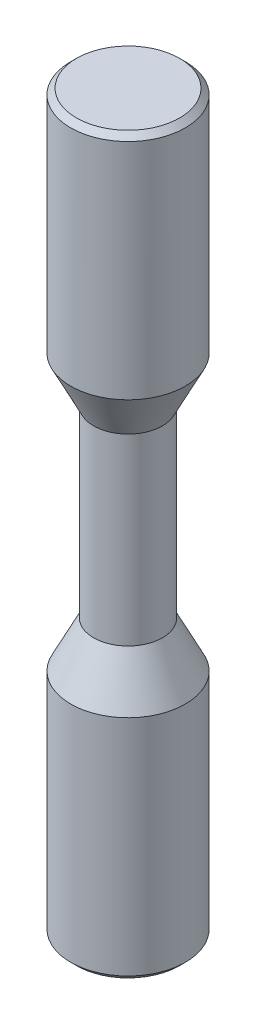
ISO-10303-21;
HEADER;
FILE_DESCRIPTION(('STEP AP214'),'2;1');
FILE_NAME('part.step','',(''),(''),'','','');
FILE_SCHEMA(('AUTOMOTIVE_DESIGN { 1 0 10303 214 1 1 1 1 }'));
ENDSEC;
DATA;
#1=APPLICATION_CONTEXT('core data for automotive mechanical design processes');
#2=APPLICATION_PROTOCOL_DEFINITION('international standard','automotive_design',2000,#1);
#3=PRODUCT_CONTEXT('',#1,'mechanical');
#4=PRODUCT('Part','Part','',(#3));
#5=PRODUCT_RELATED_PRODUCT_CATEGORY('part','',(#4));
#6=PRODUCT_DEFINITION_FORMATION('','',#4);
#7=PRODUCT_DEFINITION_CONTEXT('part definition',#1,'design');
#8=PRODUCT_DEFINITION('design','',#6,#7);
#9=PRODUCT_DEFINITION_SHAPE('','',#8);
#10=(LENGTH_UNIT() NAMED_UNIT(*) SI_UNIT(.MILLI.,.METRE.));
#11=(NAMED_UNIT(*) PLANE_ANGLE_UNIT() SI_UNIT($,.RADIAN.));
#12=(NAMED_UNIT(*) SI_UNIT($,.STERADIAN.) SOLID_ANGLE_UNIT());
#13=UNCERTAINTY_MEASURE_WITH_UNIT(LENGTH_MEASURE(1.E-05),#10,'distance_accuracy_value','');
#14=(GEOMETRIC_REPRESENTATION_CONTEXT(3) GLOBAL_UNCERTAINTY_ASSIGNED_CONTEXT((#13)) GLOBAL_UNIT_ASSIGNED_CONTEXT((#10,
#11,#12)) REPRESENTATION_CONTEXT('',''));
#15=CARTESIAN_POINT('',(0.,0.,0.));
#16=DIRECTION('',(0.,0.,1.));
#17=DIRECTION('',(1.,0.,0.));
#18=AXIS2_PLACEMENT_3D('',#15,#16,#17);
#19=CARTESIAN_POINT('',(7.9375,0.,0.));
#20=DIRECTION('',(0.,-1.,0.));
#21=DIRECTION('',(0.,0.,-1.));
#22=AXIS2_PLACEMENT_3D('',#19,#20,#21);
#23=PLANE('',#22);
#24=CARTESIAN_POINT('',(0.,0.,0.));
#25=DIRECTION('',(0.,-1.,0.));
#26=DIRECTION('',(0.,0.,-1.));
#27=AXIS2_PLACEMENT_3D('',#24,#25,#26);
#28=CIRCLE('',#27,7.14375000000002);
#29=CARTESIAN_POINT('',(0.,0.,-7.14375000000002));
#30=VERTEX_POINT('',#29);
#31=EDGE_CURVE('E58',#30,#30,#28,.T.);
#32=ORIENTED_EDGE('',*,*,#31,.T.);
#33=EDGE_LOOP('',(#32));
#34=FACE_BOUND('',#33,.T.);
#35=ADVANCED_FACE('F39',(#34),#23,.T.);
#36=CARTESIAN_POINT('',(0.,101.6,0.));
#37=DIRECTION('',(0.,1.,0.));
#38=DIRECTION('',(0.,0.,1.));
#39=AXIS2_PLACEMENT_3D('',#36,#37,#38);
#40=PLANE('',#39);
#41=CARTESIAN_POINT('',(0.,101.6,0.));
#42=DIRECTION('',(0.,1.,0.));
#43=DIRECTION('',(0.,0.,1.));
#44=AXIS2_PLACEMENT_3D('',#41,#42,#43);
#45=CIRCLE('',#44,7.14374999999999);
#46=CARTESIAN_POINT('',(0.,101.6,7.14374999999999));
#47=VERTEX_POINT('',#46);
#48=EDGE_CURVE('E10',#47,#47,#45,.T.);
#49=ORIENTED_EDGE('',*,*,#48,.T.);
#50=EDGE_LOOP('',(#49));
#51=FACE_BOUND('',#50,.T.);
#52=ADVANCED_FACE('F99',(#51),#40,.T.);
#53=CARTESIAN_POINT('',(0.,0.,0.));
#54=DIRECTION('',(0.,-1.,0.));
#55=DIRECTION('',(0.,0.,-1.));
#56=AXIS2_PLACEMENT_3D('',#53,#54,#55);
#57=CYLINDRICAL_SURFACE('',#56,7.93749999999999);
#58=CARTESIAN_POINT('',(0.,100.80625,0.));
#59=DIRECTION('',(0.,1.,0.));
#60=DIRECTION('',(0.,0.,1.));
#61=AXIS2_PLACEMENT_3D('',#58,#59,#60);
#62=CIRCLE('',#61,7.93749999999999);
#63=CARTESIAN_POINT('',(0.,100.80625,7.93749999999999));
#64=VERTEX_POINT('',#63);
#65=EDGE_CURVE('E48',#64,#64,#62,.F.);
#66=ORIENTED_EDGE('',*,*,#65,.T.);
#67=EDGE_LOOP('',(#66));
#68=FACE_BOUND('',#67,.T.);
#69=CARTESIAN_POINT('',(0.,69.85,0.));
#70=DIRECTION('',(0.,-1.,0.));
#71=DIRECTION('',(0.,0.,-1.));
#72=AXIS2_PLACEMENT_3D('',#69,#70,#71);
#73=CIRCLE('',#72,7.93749999999999);
#74=CARTESIAN_POINT('',(0.,69.85,-7.93749999999999));
#75=VERTEX_POINT('',#74);
#76=EDGE_CURVE('E64',#75,#75,#73,.T.);
#77=ORIENTED_EDGE('',*,*,#76,.F.);
#78=EDGE_LOOP('',(#77));
#79=FACE_BOUND('',#78,.T.);
#80=ADVANCED_FACE('F105',(#68,#79),#57,.T.);
#81=CARTESIAN_POINT('',(0.,63.5,0.));
#82=DIRECTION('',(0.,1.,0.));
#83=DIRECTION('',(0.,0.,1.));
#84=AXIS2_PLACEMENT_3D('',#81,#82,#83);
#85=CONICAL_SURFACE('',#84,4.76249999999999,0.463647609000806);
#86=ORIENTED_EDGE('',*,*,#76,.T.);
#87=EDGE_LOOP('',(#86));
#88=FACE_BOUND('',#87,.T.);
#89=CARTESIAN_POINT('',(0.,63.5,0.));
#90=DIRECTION('',(0.,-1.,0.));
#91=DIRECTION('',(0.,0.,-1.));
#92=AXIS2_PLACEMENT_3D('',#89,#90,#91);
#93=CIRCLE('',#92,4.76249999999999);
#94=CARTESIAN_POINT('',(0.,63.5,-4.76249999999999));
#95=VERTEX_POINT('',#94);
#96=EDGE_CURVE('E68',#95,#95,#93,.T.);
#97=ORIENTED_EDGE('',*,*,#96,.F.);
#98=EDGE_LOOP('',(#97));
#99=FACE_BOUND('',#98,.T.);
#100=ADVANCED_FACE('F95',(#88,#99),#85,.T.);
#101=CARTESIAN_POINT('',(0.,0.,0.));
#102=DIRECTION('',(0.,-1.,0.));
#103=DIRECTION('',(0.,0.,-1.));
#104=AXIS2_PLACEMENT_3D('',#101,#102,#103);
#105=CYLINDRICAL_SURFACE('',#104,4.76249999999999);
#106=ORIENTED_EDGE('',*,*,#96,.T.);
#107=EDGE_LOOP('',(#106));
#108=FACE_BOUND('',#107,.T.);
#109=CARTESIAN_POINT('',(0.,38.1,0.));
#110=DIRECTION('',(0.,-1.,0.));
#111=DIRECTION('',(0.,0.,-1.));
#112=AXIS2_PLACEMENT_3D('',#109,#110,#111);
#113=CIRCLE('',#112,4.7625);
#114=CARTESIAN_POINT('',(0.,38.1,-4.7625));
#115=VERTEX_POINT('',#114);
#116=EDGE_CURVE('E72',#115,#115,#113,.T.);
#117=ORIENTED_EDGE('',*,*,#116,.F.);
#118=EDGE_LOOP('',(#117));
#119=FACE_BOUND('',#118,.T.);
#120=ADVANCED_FACE('F85',(#108,#119),#105,.T.);
#121=CARTESIAN_POINT('',(0.,31.75,0.));
#122=DIRECTION('',(0.,-1.,0.));
#123=DIRECTION('',(0.,0.,-1.));
#124=AXIS2_PLACEMENT_3D('',#121,#122,#123);
#125=CONICAL_SURFACE('',#124,7.9375,0.463647609000806);
#126=ORIENTED_EDGE('',*,*,#116,.T.);
#127=EDGE_LOOP('',(#126));
#128=FACE_BOUND('',#127,.T.);
#129=CARTESIAN_POINT('',(0.,31.75,0.));
#130=DIRECTION('',(0.,-1.,0.));
#131=DIRECTION('',(0.,0.,-1.));
#132=AXIS2_PLACEMENT_3D('',#129,#130,#131);
#133=CIRCLE('',#132,7.9375);
#134=CARTESIAN_POINT('',(0.,31.75,-7.9375));
#135=VERTEX_POINT('',#134);
#136=EDGE_CURVE('E76',#135,#135,#133,.T.);
#137=ORIENTED_EDGE('',*,*,#136,.F.);
#138=EDGE_LOOP('',(#137));
#139=FACE_BOUND('',#138,.T.);
#140=ADVANCED_FACE('F83',(#128,#139),#125,.T.);
#141=CARTESIAN_POINT('',(0.,0.,0.));
#142=DIRECTION('',(0.,-1.,0.));
#143=DIRECTION('',(0.,0.,-1.));
#144=AXIS2_PLACEMENT_3D('',#141,#142,#143);
#145=CYLINDRICAL_SURFACE('',#144,7.9375);
#146=CARTESIAN_POINT('',(0.,0.793749999999994,0.));
#147=DIRECTION('',(0.,-1.,0.));
#148=DIRECTION('',(0.,0.,-1.));
#149=AXIS2_PLACEMENT_3D('',#146,#147,#148);
#150=CIRCLE('',#149,7.9375);
#151=CARTESIAN_POINT('',(0.,0.793749999999994,-7.9375));
#152=VERTEX_POINT('',#151);
#153=EDGE_CURVE('E53',#152,#152,#150,.F.);
#154=ORIENTED_EDGE('',*,*,#153,.T.);
#155=EDGE_LOOP('',(#154));
#156=FACE_BOUND('',#155,.T.);
#157=ORIENTED_EDGE('',*,*,#136,.T.);
#158=EDGE_LOOP('',(#157));
#159=FACE_BOUND('',#158,.T.);
#160=ADVANCED_FACE('F81',(#156,#159),#145,.T.);
#161=CARTESIAN_POINT('',(0.,0.,0.));
#162=DIRECTION('',(0.,1.,0.));
#163=DIRECTION('',(0.,0.,1.));
#164=AXIS2_PLACEMENT_3D('',#161,#162,#163);
#165=CONICAL_SURFACE('',#164,7.14375000000002,0.78539816339744);
#166=ORIENTED_EDGE('',*,*,#153,.F.);
#167=EDGE_LOOP('',(#166));
#168=FACE_BOUND('',#167,.T.);
#169=ORIENTED_EDGE('',*,*,#31,.F.);
#170=EDGE_LOOP('',(#169));
#171=FACE_BOUND('',#170,.T.);
#172=ADVANCED_FACE('F92',(#168,#171),#165,.T.);
#173=CARTESIAN_POINT('',(0.,100.80625,0.));
#174=DIRECTION('',(0.,-1.,0.));
#175=DIRECTION('',(0.,0.,-1.));
#176=AXIS2_PLACEMENT_3D('',#173,#174,#175);
#177=CONICAL_SURFACE('',#176,7.93749999999999,0.785398163397442);
#178=ORIENTED_EDGE('',*,*,#48,.F.);
#179=EDGE_LOOP('',(#178));
#180=FACE_BOUND('',#179,.T.);
#181=ORIENTED_EDGE('',*,*,#65,.F.);
#182=EDGE_LOOP('',(#181));
#183=FACE_BOUND('',#182,.T.);
#184=ADVANCED_FACE('F42',(#180,#183),#177,.T.);
#185=CLOSED_SHELL('',(#35,#52,#80,#100,#120,#140,#160,#172,#184));
#186=MANIFOLD_SOLID_BREP('B2',#185);
#187=ADVANCED_BREP_SHAPE_REPRESENTATION('',(#18,#186),#14);
#188=SHAPE_DEFINITION_REPRESENTATION(#9,#187);
ENDSEC;
END-ISO-10303-21;
